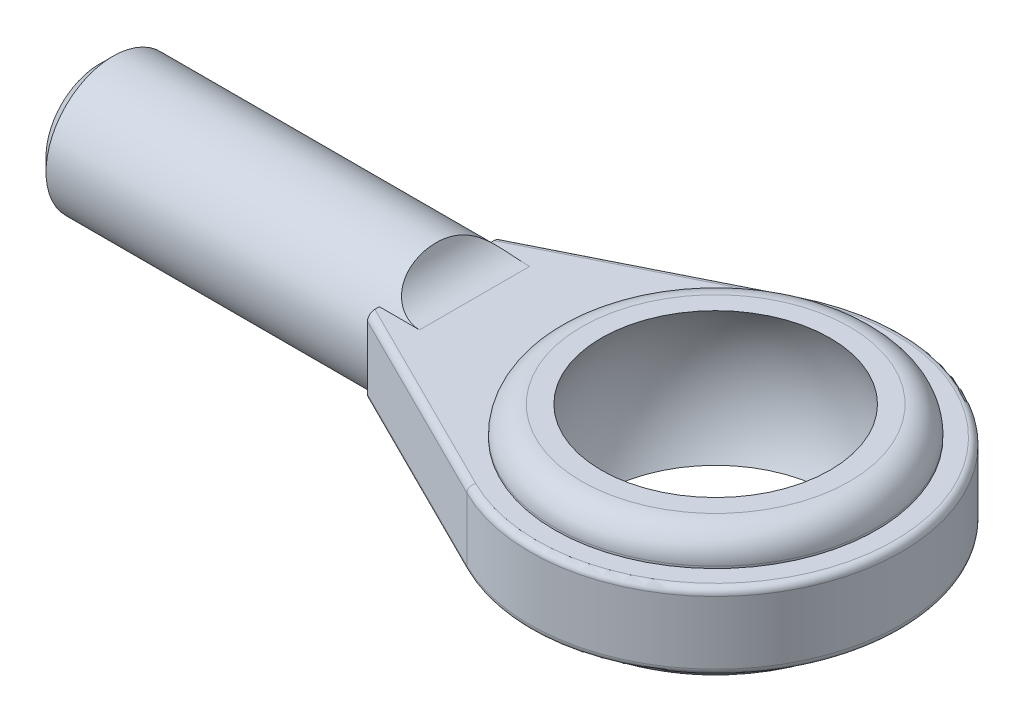
ISO-10303-21;
HEADER;
FILE_DESCRIPTION(('STEP AP214'),'2;1');
FILE_NAME('part.step','',(''),(''),'','','');
FILE_SCHEMA(('AUTOMOTIVE_DESIGN { 1 0 10303 214 1 1 1 1 }'));
ENDSEC;
DATA;
#1=APPLICATION_CONTEXT('core data for automotive mechanical design processes');
#2=APPLICATION_PROTOCOL_DEFINITION('international standard','automotive_design',2000,#1);
#3=PRODUCT_CONTEXT('',#1,'mechanical');
#4=PRODUCT('Part','Part','',(#3));
#5=PRODUCT_RELATED_PRODUCT_CATEGORY('part','',(#4));
#6=PRODUCT_DEFINITION_FORMATION('','',#4);
#7=PRODUCT_DEFINITION_CONTEXT('part definition',#1,'design');
#8=PRODUCT_DEFINITION('design','',#6,#7);
#9=PRODUCT_DEFINITION_SHAPE('','',#8);
#10=(LENGTH_UNIT() NAMED_UNIT(*) SI_UNIT(.MILLI.,.METRE.));
#11=(NAMED_UNIT(*) PLANE_ANGLE_UNIT() SI_UNIT($,.RADIAN.));
#12=(NAMED_UNIT(*) SI_UNIT($,.STERADIAN.) SOLID_ANGLE_UNIT());
#13=UNCERTAINTY_MEASURE_WITH_UNIT(LENGTH_MEASURE(1.E-05),#10,'distance_accuracy_value','');
#14=(GEOMETRIC_REPRESENTATION_CONTEXT(3) GLOBAL_UNCERTAINTY_ASSIGNED_CONTEXT((#13)) GLOBAL_UNIT_ASSIGNED_CONTEXT((#10,
#11,#12)) REPRESENTATION_CONTEXT('',''));
#15=CARTESIAN_POINT('',(0.,0.,0.));
#16=DIRECTION('',(0.,0.,1.));
#17=DIRECTION('',(1.,0.,0.));
#18=AXIS2_PLACEMENT_3D('',#15,#16,#17);
#19=CARTESIAN_POINT('',(46.,-5.,0.));
#20=DIRECTION('',(0.,1.,0.));
#21=DIRECTION('',(0.,0.,1.));
#22=AXIS2_PLACEMENT_3D('',#19,#20,#21);
#23=PLANE('',#22);
#24=CARTESIAN_POINT('',(46.,-5.,0.));
#25=DIRECTION('',(0.,1.,0.));
#26=DIRECTION('',(0.,0.,1.));
#27=AXIS2_PLACEMENT_3D('',#24,#25,#26);
#28=CIRCLE('',#27,10.);
#29=CARTESIAN_POINT('',(46.,-5.,10.));
#30=VERTEX_POINT('',#29);
#31=EDGE_CURVE('E494',#30,#30,#28,.F.);
#32=ORIENTED_EDGE('',*,*,#31,.T.);
#33=EDGE_LOOP('',(#32));
#34=FACE_BOUND('',#33,.T.);
#35=CARTESIAN_POINT('',(46.,-5.,0.));
#36=DIRECTION('',(0.,1.,0.));
#37=DIRECTION('',(0.,0.,1.));
#38=AXIS2_PLACEMENT_3D('',#35,#36,#37);
#39=CIRCLE('',#38,8.54458893101359);
#40=CARTESIAN_POINT('',(46.,-5.,8.54458893101359));
#41=VERTEX_POINT('',#40);
#42=EDGE_CURVE('E482',#41,#41,#39,.F.);
#43=ORIENTED_EDGE('',*,*,#42,.F.);
#44=EDGE_LOOP('',(#43));
#45=FACE_BOUND('',#44,.T.);
#46=ADVANCED_FACE('F36',(#34,#45),#23,.F.);
#47=CARTESIAN_POINT('',(46.,5.,0.));
#48=DIRECTION('',(0.,1.,0.));
#49=DIRECTION('',(0.,0.,1.));
#50=AXIS2_PLACEMENT_3D('',#47,#48,#49);
#51=PLANE('',#50);
#52=CARTESIAN_POINT('',(46.,5.,0.));
#53=DIRECTION('',(0.,1.,0.));
#54=DIRECTION('',(0.,0.,1.));
#55=AXIS2_PLACEMENT_3D('',#52,#53,#54);
#56=CIRCLE('',#55,10.);
#57=CARTESIAN_POINT('',(46.,5.,10.));
#58=VERTEX_POINT('',#57);
#59=EDGE_CURVE('E46',#58,#58,#56,.T.);
#60=ORIENTED_EDGE('',*,*,#59,.T.);
#61=EDGE_LOOP('',(#60));
#62=FACE_BOUND('',#61,.T.);
#63=CARTESIAN_POINT('',(46.,5.,0.));
#64=DIRECTION('',(0.,1.,0.));
#65=DIRECTION('',(0.,0.,1.));
#66=AXIS2_PLACEMENT_3D('',#63,#64,#65);
#67=CIRCLE('',#66,8.54458893101359);
#68=CARTESIAN_POINT('',(46.,5.,8.54458893101359));
#69=VERTEX_POINT('',#68);
#70=EDGE_CURVE('E40',#69,#69,#67,.F.);
#71=ORIENTED_EDGE('',*,*,#70,.T.);
#72=EDGE_LOOP('',(#71));
#73=FACE_BOUND('',#72,.T.);
#74=ADVANCED_FACE('F152',(#62,#73),#51,.T.);
#75=CARTESIAN_POINT('',(0.,2.85,0.));
#76=DIRECTION('',(0.,1.,0.));
#77=DIRECTION('',(0.,0.,1.));
#78=AXIS2_PLACEMENT_3D('',#75,#76,#77);
#79=PLANE('',#78);
#80=DIRECTION('',(0.,0.,1.));
#81=VECTOR('',#80,1.);
#82=CARTESIAN_POINT('',(28.,2.85,4.10822346032929));
#83=LINE('',#82,#81);
#84=CARTESIAN_POINT('',(28.,2.85,-4.10822346032929));
#85=VERTEX_POINT('',#84);
#86=CARTESIAN_POINT('',(28.,2.85,4.10822346032929));
#87=VERTEX_POINT('',#86);
#88=EDGE_CURVE('E90',#85,#87,#83,.T.);
#89=ORIENTED_EDGE('',*,*,#88,.T.);
#90=DIRECTION('',(-1.,0.,0.));
#91=VECTOR('',#90,1.);
#92=CARTESIAN_POINT('',(28.,2.85,4.10822346032929));
#93=LINE('',#92,#91);
#94=CARTESIAN_POINT('',(25.,2.85,4.10822346032929));
#95=VERTEX_POINT('',#94);
#96=EDGE_CURVE('E95',#87,#95,#93,.T.);
#97=ORIENTED_EDGE('',*,*,#96,.T.);
#98=DIRECTION('',(0.,0.,1.));
#99=VECTOR('',#98,1.);
#100=CARTESIAN_POINT('',(25.,2.85,0.));
#101=LINE('',#100,#99);
#102=CARTESIAN_POINT('',(25.,2.85,4.4412127348407));
#103=VERTEX_POINT('',#102);
#104=EDGE_CURVE('E292',#95,#103,#101,.T.);
#105=ORIENTED_EDGE('',*,*,#104,.T.);
#106=DIRECTION('',(0.894794908859371,0.,0.446477402652531));
#107=VECTOR('',#106,1.);
#108=CARTESIAN_POINT('',(40.0395266745887,2.85,11.9455120332726));
#109=LINE('',#108,#107);
#110=CARTESIAN_POINT('',(40.0395266745887,2.85,11.9455120332726));
#111=VERTEX_POINT('',#110);
#112=EDGE_CURVE('E231',#103,#111,#109,.T.);
#113=ORIENTED_EDGE('',*,*,#112,.T.);
#114=CARTESIAN_POINT('',(46.,2.85,0.));
#115=DIRECTION('',(0.,1.,0.));
#116=DIRECTION('',(0.,0.,1.));
#117=AXIS2_PLACEMENT_3D('',#114,#115,#116);
#118=CIRCLE('',#117,13.35);
#119=CARTESIAN_POINT('',(40.0395266745887,2.85,-11.9455120332726));
#120=VERTEX_POINT('',#119);
#121=EDGE_CURVE('E234',#111,#120,#118,.T.);
#122=ORIENTED_EDGE('',*,*,#121,.T.);
#123=DIRECTION('',(-0.894794908859371,0.,0.446477402652531));
#124=VECTOR('',#123,1.);
#125=CARTESIAN_POINT('',(25.2232387013263,2.85,-4.55260254557032));
#126=LINE('',#125,#124);
#127=CARTESIAN_POINT('',(25.,2.85,-4.44121273484069));
#128=VERTEX_POINT('',#127);
#129=EDGE_CURVE('E237',#120,#128,#126,.T.);
#130=ORIENTED_EDGE('',*,*,#129,.T.);
#131=CARTESIAN_POINT('',(25.,2.85,-4.10822346032929));
#132=VERTEX_POINT('',#131);
#133=EDGE_CURVE('E294',#128,#132,#101,.T.);
#134=ORIENTED_EDGE('',*,*,#133,.T.);
#135=DIRECTION('',(-1.,0.,0.));
#136=VECTOR('',#135,1.);
#137=CARTESIAN_POINT('',(25.,2.85,-4.10822346032929));
#138=LINE('',#137,#136);
#139=EDGE_CURVE('E54',#132,#85,#138,.F.);
#140=ORIENTED_EDGE('',*,*,#139,.T.);
#141=EDGE_LOOP('',(#89,#97,#105,#113,#122,#130,#134,#140));
#142=FACE_BOUND('',#141,.T.);
#143=CARTESIAN_POINT('',(46.,2.85,0.));
#144=DIRECTION('',(0.,1.,0.));
#145=DIRECTION('',(0.,0.,1.));
#146=AXIS2_PLACEMENT_3D('',#143,#144,#145);
#147=CIRCLE('',#146,12.);
#148=CARTESIAN_POINT('',(46.,2.85,12.));
#149=VERTEX_POINT('',#148);
#150=EDGE_CURVE('E264',#149,#149,#147,.F.);
#151=ORIENTED_EDGE('',*,*,#150,.T.);
#152=EDGE_LOOP('',(#151));
#153=FACE_BOUND('',#152,.T.);
#154=ADVANCED_FACE('F105',(#142,#153),#79,.T.);
#155=CARTESIAN_POINT('',(0.,-2.85,0.));
#156=DIRECTION('',(0.,1.,0.));
#157=DIRECTION('',(0.,0.,1.));
#158=AXIS2_PLACEMENT_3D('',#155,#156,#157);
#159=PLANE('',#158);
#160=DIRECTION('',(0.,0.,1.));
#161=VECTOR('',#160,1.);
#162=CARTESIAN_POINT('',(25.,-2.85,0.));
#163=LINE('',#162,#161);
#164=CARTESIAN_POINT('',(25.,-2.85,4.10822346032929));
#165=VERTEX_POINT('',#164);
#166=CARTESIAN_POINT('',(25.,-2.85,4.44121273484069));
#167=VERTEX_POINT('',#166);
#168=EDGE_CURVE('E260',#165,#167,#163,.T.);
#169=ORIENTED_EDGE('',*,*,#168,.F.);
#170=DIRECTION('',(-1.,0.,0.));
#171=VECTOR('',#170,1.);
#172=CARTESIAN_POINT('',(25.,-2.85,4.10822346032929));
#173=LINE('',#172,#171);
#174=CARTESIAN_POINT('',(28.,-2.85,4.10822346032929));
#175=VERTEX_POINT('',#174);
#176=EDGE_CURVE('E108',#165,#175,#173,.F.);
#177=ORIENTED_EDGE('',*,*,#176,.T.);
#178=DIRECTION('',(0.,0.,1.));
#179=VECTOR('',#178,1.);
#180=CARTESIAN_POINT('',(28.,-2.85,0.));
#181=LINE('',#180,#179);
#182=CARTESIAN_POINT('',(28.,-2.85,-4.10822346032929));
#183=VERTEX_POINT('',#182);
#184=EDGE_CURVE('E269',#175,#183,#181,.F.);
#185=ORIENTED_EDGE('',*,*,#184,.T.);
#186=DIRECTION('',(-1.,0.,0.));
#187=VECTOR('',#186,1.);
#188=CARTESIAN_POINT('',(28.,-2.85,-4.10822346032929));
#189=LINE('',#188,#187);
#190=CARTESIAN_POINT('',(25.,-2.85,-4.10822346032929));
#191=VERTEX_POINT('',#190);
#192=EDGE_CURVE('E252',#183,#191,#189,.T.);
#193=ORIENTED_EDGE('',*,*,#192,.T.);
#194=CARTESIAN_POINT('',(25.,-2.85,-4.44121273484069));
#195=VERTEX_POINT('',#194);
#196=EDGE_CURVE('E285',#195,#191,#163,.T.);
#197=ORIENTED_EDGE('',*,*,#196,.F.);
#198=DIRECTION('',(-0.894794908859371,0.,0.446477402652531));
#199=VECTOR('',#198,1.);
#200=CARTESIAN_POINT('',(3.20926194423882,-2.85,6.43175048018243));
#201=LINE('',#200,#199);
#202=CARTESIAN_POINT('',(40.0395266745887,-2.85,-11.9455120332726));
#203=VERTEX_POINT('',#202);
#204=EDGE_CURVE('E213',#195,#203,#201,.F.);
#205=ORIENTED_EDGE('',*,*,#204,.T.);
#206=CARTESIAN_POINT('',(46.,-2.85,0.));
#207=DIRECTION('',(0.,1.,0.));
#208=DIRECTION('',(0.,0.,1.));
#209=AXIS2_PLACEMENT_3D('',#206,#207,#208);
#210=CIRCLE('',#209,13.35);
#211=CARTESIAN_POINT('',(40.0395266745887,-2.85,11.9455120332726));
#212=VERTEX_POINT('',#211);
#213=EDGE_CURVE('E216',#203,#212,#210,.F.);
#214=ORIENTED_EDGE('',*,*,#213,.T.);
#215=DIRECTION('',(0.894794908859371,0.,0.446477402652531));
#216=VECTOR('',#215,1.);
#217=CARTESIAN_POINT('',(3.20926194423882,-2.85,-6.43175048018243));
#218=LINE('',#217,#216);
#219=EDGE_CURVE('E219',#212,#167,#218,.F.);
#220=ORIENTED_EDGE('',*,*,#219,.T.);
#221=EDGE_LOOP('',(#169,#177,#185,#193,#197,#205,#214,#220));
#222=FACE_BOUND('',#221,.T.);
#223=CARTESIAN_POINT('',(46.,-2.85,0.));
#224=DIRECTION('',(0.,1.,0.));
#225=DIRECTION('',(0.,0.,1.));
#226=AXIS2_PLACEMENT_3D('',#223,#224,#225);
#227=CIRCLE('',#226,12.);
#228=CARTESIAN_POINT('',(46.,-2.85,12.));
#229=VERTEX_POINT('',#228);
#230=EDGE_CURVE('E91',#229,#229,#227,.F.);
#231=ORIENTED_EDGE('',*,*,#230,.F.);
#232=EDGE_LOOP('',(#231));
#233=FACE_BOUND('',#232,.T.);
#234=ADVANCED_FACE('F166',(#222,#233),#159,.F.);
#235=CARTESIAN_POINT('',(25.,0.,0.));
#236=DIRECTION('',(-1.,0.,0.));
#237=DIRECTION('',(0.,0.,1.));
#238=AXIS2_PLACEMENT_3D('',#235,#236,#237);
#239=CYLINDRICAL_SURFACE('',#238,5.);
#240=CARTESIAN_POINT('',(0.999999999999994,0.,0.));
#241=DIRECTION('',(1.,0.,0.));
#242=DIRECTION('',(0.,0.,-1.));
#243=AXIS2_PLACEMENT_3D('',#240,#241,#242);
#244=CIRCLE('',#243,5.);
#245=CARTESIAN_POINT('',(0.999999999999994,0.,-5.));
#246=VERTEX_POINT('',#245);
#247=EDGE_CURVE('E201',#246,#246,#244,.T.);
#248=ORIENTED_EDGE('',*,*,#247,.T.);
#249=EDGE_LOOP('',(#248));
#250=FACE_BOUND('',#249,.T.);
#251=CARTESIAN_POINT('',(25.,0.,0.));
#252=DIRECTION('',(1.,0.,0.));
#253=DIRECTION('',(0.,0.,-1.));
#254=AXIS2_PLACEMENT_3D('',#251,#252,#253);
#255=CIRCLE('',#254,5.);
#256=CARTESIAN_POINT('',(25.,0.,-5.));
#257=VERTEX_POINT('',#256);
#258=EDGE_CURVE('E207',#257,#132,#255,.T.);
#259=ORIENTED_EDGE('',*,*,#258,.F.);
#260=EDGE_CURVE('E281',#191,#257,#255,.T.);
#261=ORIENTED_EDGE('',*,*,#260,.F.);
#262=ORIENTED_EDGE('',*,*,#192,.F.);
#263=CARTESIAN_POINT('',(28.,-2.85,-4.10822346032929));
#264=CARTESIAN_POINT('',(27.9303186688484,-2.84998832247719,-4.10821820050659));
#265=CARTESIAN_POINT('',(27.8606402898119,-2.85242754556558,-4.10653904132021));
#266=CARTESIAN_POINT('',(27.7217870519596,-2.86212066891751,-4.09979623791976));
#267=CARTESIAN_POINT('',(27.6526121704488,-2.86937435079394,-4.0947327472212));
#268=CARTESIAN_POINT('',(27.5153444812102,-2.88859705028777,-4.08119321639225));
#269=CARTESIAN_POINT('',(27.4472504091321,-2.90056005890779,-4.07272152474992));
#270=CARTESIAN_POINT('',(27.3125646655309,-2.92901054021996,-4.05230811407998));
#271=CARTESIAN_POINT('',(27.2459729659732,-2.94549792841068,-4.0403664598603));
#272=CARTESIAN_POINT('',(27.049076056239,-3.00143940580205,-3.99919237297866));
#273=CARTESIAN_POINT('',(26.921617891859,-3.04737729302536,-3.96460786181355));
#274=CARTESIAN_POINT('',(26.6782342153292,-3.15359642341774,-3.88064070023662));
#275=CARTESIAN_POINT('',(26.5623040208376,-3.21387180906914,-3.83126409093543));
#276=CARTESIAN_POINT('',(26.3443836809313,-3.34497860422588,-3.71734380494492));
#277=CARTESIAN_POINT('',(26.2424220719609,-3.41583102259598,-3.6527697914657));
#278=CARTESIAN_POINT('',(26.0543198858799,-3.56337668279178,-3.50897998035171));
#279=CARTESIAN_POINT('',(25.968183880406,-3.64007160335317,-3.42975996505655));
#280=CARTESIAN_POINT('',(25.807255855965,-3.79927869136991,-3.25276298317516));
#281=CARTESIAN_POINT('',(25.7334536941143,-3.88186392796828,-3.15415815564555));
#282=CARTESIAN_POINT('',(25.6025282132696,-4.04362480894875,-2.94392582919759));
#283=CARTESIAN_POINT('',(25.5454164026809,-4.12279806877034,-2.83228941856293));
#284=CARTESIAN_POINT('',(25.4592489368039,-4.25346305387998,-2.63027889944279));
#285=CARTESIAN_POINT('',(25.4267878409945,-4.30662418855518,-2.54238694083889));
#286=CARTESIAN_POINT('',(25.3684964844295,-4.40825692737118,-2.36177936231872));
#287=CARTESIAN_POINT('',(25.3426687467899,-4.45672674272976,-2.26906192302381));
#288=CARTESIAN_POINT('',(25.2966417977775,-4.54827630510536,-2.07949187759872));
#289=CARTESIAN_POINT('',(25.2764512996815,-4.59134765190238,-1.98263313392876));
#290=CARTESIAN_POINT('',(25.2408270808472,-4.67148931632098,-1.78563587186882));
#291=CARTESIAN_POINT('',(25.2253929638033,-4.70856013378933,-1.68549762749908));
#292=CARTESIAN_POINT('',(25.1982135555671,-4.77697915423675,-1.48065912405262));
#293=CARTESIAN_POINT('',(25.1865436162853,-4.80820575782674,-1.3759083915642));
#294=CARTESIAN_POINT('',(25.1665829078419,-4.86378537938973,-1.16428597928896));
#295=CARTESIAN_POINT('',(25.1582922396844,-4.88813819190307,-1.05741423620666));
#296=CARTESIAN_POINT('',(25.1445371722631,-4.92977591978916,-0.842207436817576));
#297=CARTESIAN_POINT('',(25.1390707312865,-4.94706593915406,-0.733873495877078));
#298=CARTESIAN_POINT('',(25.130559374402,-4.97449067563795,-0.516212236972134));
#299=CARTESIAN_POINT('',(25.127514441644,-4.98462544254699,-0.406884925925445));
#300=CARTESIAN_POINT('',(25.1236153195624,-4.99767523058154,-0.18781943289105));
#301=CARTESIAN_POINT('',(25.1227599886208,-5.00059401396,-0.0780814948990185));
#302=CARTESIAN_POINT('',(25.1231701806434,-4.9992058851635,0.141342679568152));
#303=CARTESIAN_POINT('',(25.1244356678111,-4.99489909494563,0.251028916884665));
#304=CARTESIAN_POINT('',(25.1291880173162,-4.97907678914304,0.469946168769332));
#305=CARTESIAN_POINT('',(25.1326771373973,-4.96755394701781,0.579176606954942));
#306=CARTESIAN_POINT('',(25.1421431882871,-4.93736452364006,0.796537785527815));
#307=CARTESIAN_POINT('',(25.1481201674756,-4.91869780346591,0.904668504487686));
#308=CARTESIAN_POINT('',(25.1641920581718,-4.87074633425353,1.13667833061227));
#309=CARTESIAN_POINT('',(25.174797206284,-4.84023137193876,1.2602709700166));
#310=CARTESIAN_POINT('',(25.2008842542286,-4.77002200078848,1.50433209585922));
#311=CARTESIAN_POINT('',(25.2163671842234,-4.73032565336339,1.62479991652979));
#312=CARTESIAN_POINT('',(25.2534128504999,-4.64230090484644,1.86144038246558));
#313=CARTESIAN_POINT('',(25.2749689744178,-4.59398191276633,1.9776175445599));
#314=CARTESIAN_POINT('',(25.3256259788118,-4.48945065090949,2.20463697680034));
#315=CARTESIAN_POINT('',(25.3547232409578,-4.43324217251746,2.31548177532121));
#316=CARTESIAN_POINT('',(25.4118239756425,-4.33223716110919,2.49780823041855));
#317=CARTESIAN_POINT('',(25.4374637004573,-4.28917584696735,2.57100026574287));
#318=CARTESIAN_POINT('',(25.493734082226,-4.20033445781241,2.71371493832222));
#319=CARTESIAN_POINT('',(25.5243634414637,-4.15455509167914,2.78323852346884));
#320=CARTESIAN_POINT('',(25.5911105688942,-4.06099288971023,2.91805706483879));
#321=CARTESIAN_POINT('',(25.6272215897753,-4.01321256847526,2.98335708078897));
#322=CARTESIAN_POINT('',(25.7053919090472,-3.91644218876245,3.10930862706907));
#323=CARTESIAN_POINT('',(25.7474503975808,-3.86745229573852,3.16996078855908));
#324=CARTESIAN_POINT('',(25.8695121213876,-3.73484849433126,3.326791027619));
#325=CARTESIAN_POINT('',(25.9555030636483,-3.65094592472109,3.41820045801525));
#326=CARTESIAN_POINT('',(26.1462276080144,-3.48796908278923,3.5843628206952));
#327=CARTESIAN_POINT('',(26.250952301285,-3.4088925393196,3.65912363245738));
#328=CARTESIAN_POINT('',(26.421033392792,-3.2982354871994,3.75820835100824));
#329=CARTESIAN_POINT('',(26.4800501045519,-3.26260023623442,3.78911885582788));
#330=CARTESIAN_POINT('',(26.6020317016305,-3.19471405657716,3.84652729435049));
#331=CARTESIAN_POINT('',(26.6649949560769,-3.1624617444558,3.87302703442705));
#332=CARTESIAN_POINT('',(26.7944957131381,-3.10193227724424,3.92167421379003));
#333=CARTESIAN_POINT('',(26.861036616825,-3.07365900055875,3.94381741496589));
#334=CARTESIAN_POINT('',(26.9970907236996,-3.02166603004237,3.98379337095368));
#335=CARTESIAN_POINT('',(27.0666025941523,-2.99794432011933,4.00162803512018));
#336=CARTESIAN_POINT('',(27.2060707056782,-2.95607041026386,4.03265532191704));
#337=CARTESIAN_POINT('',(27.2759599605587,-2.93778081640282,4.0459639783944));
#338=CARTESIAN_POINT('',(27.417478434309,-2.90620545649625,4.06870326339941));
#339=CARTESIAN_POINT('',(27.4891076445596,-2.89291966566907,4.07813391113315));
#340=CARTESIAN_POINT('',(27.6336488851626,-2.87155644111875,4.09320718119619));
#341=CARTESIAN_POINT('',(27.706562770614,-2.86348730486153,4.09884376938306));
#342=CARTESIAN_POINT('',(27.8529839836139,-2.85270112202323,4.1063490913996));
#343=CARTESIAN_POINT('',(27.9264913607415,-2.84998452732649,4.10821750710442));
#344=CARTESIAN_POINT('',(28.,-2.85,4.10822346032931));
#345=B_SPLINE_CURVE_WITH_KNOTS('',3,(#263,#264,#265,#266,#267,#268,#269,#270,#271,#272,#273,
#274,#275,#276,#277,#278,#279,#280,#281,#282,#283,#284,#285,#286,#287,#288,#289,#290,#291,#292,
#293,#294,#295,#296,#297,#298,#299,#300,#301,#302,#303,#304,#305,#306,#307,#308,#309,#310,#311,
#312,#313,#314,#315,#316,#317,#318,#319,#320,#321,#322,#323,#324,#325,#326,#327,#328,#329,#330,
#331,#332,#333,#334,#335,#336,#337,#338,#339,#340,#341,#342,#343,#344),.UNSPECIFIED.,.F.,.F.,(4,
2,2,2,2,2,2,2,2,2,2,2,2,2,2,2,2,2,2,2,2,2,2,2,2,2,2,2,2,2,2,2,2,2,2,2,2,2,2,2,4),(0.,
0.208975752294004,0.417942025954421,0.626642523032518,0.835339122495654,1.2526387231238,
1.66976812989201,2.08773737325647,2.50582716870298,2.94898553917731,3.39244876108348,
3.71522049033353,4.03811481034387,4.36150548779123,4.68486921277202,5.01435358496723,
5.34384780450535,5.67310348897956,6.00235688229557,6.33143857399572,6.66051471133568,
6.98992550636779,7.31934270752896,7.70212419816384,8.0849865845149,8.46743371879285,
8.84969768891184,9.11558754502652,9.38140835794533,9.64690458927438,9.91236470314916,
10.3632010773517,10.8138236235366,11.0402239450061,11.2665313176929,11.4930577688936,
11.7194836486012,11.9395671759841,12.1596496133758,12.3800812520987,12.6005314998019),.UNSPECIFIED.);
#346=EDGE_CURVE('E66',#183,#175,#345,.T.);
#347=ORIENTED_EDGE('',*,*,#346,.T.);
#348=ORIENTED_EDGE('',*,*,#176,.F.);
#349=CARTESIAN_POINT('',(25.,0.,5.));
#350=VERTEX_POINT('',#349);
#351=EDGE_CURVE('E277',#350,#165,#255,.T.);
#352=ORIENTED_EDGE('',*,*,#351,.F.);
#353=EDGE_CURVE('E100',#95,#350,#255,.T.);
#354=ORIENTED_EDGE('',*,*,#353,.F.);
#355=ORIENTED_EDGE('',*,*,#96,.F.);
#356=CARTESIAN_POINT('',(28.,2.85,4.10822346032929));
#357=CARTESIAN_POINT('',(27.9303186688484,2.84998832247719,4.10821820050659));
#358=CARTESIAN_POINT('',(27.8606402898119,2.85242754556558,4.10653904132021));
#359=CARTESIAN_POINT('',(27.7217870519596,2.86212066891751,4.09979623791976));
#360=CARTESIAN_POINT('',(27.6526121704488,2.86937435079394,4.0947327472212));
#361=CARTESIAN_POINT('',(27.5153444812102,2.88859705028777,4.08119321639225));
#362=CARTESIAN_POINT('',(27.4472504091321,2.90056005890779,4.07272152474992));
#363=CARTESIAN_POINT('',(27.3125646655309,2.92901054021996,4.05230811407998));
#364=CARTESIAN_POINT('',(27.2459729659732,2.94549792841068,4.0403664598603));
#365=CARTESIAN_POINT('',(27.049076056239,3.00143940580205,3.99919237297866));
#366=CARTESIAN_POINT('',(26.921617891859,3.04737729302536,3.96460786181355));
#367=CARTESIAN_POINT('',(26.6782342153292,3.15359642341774,3.88064070023662));
#368=CARTESIAN_POINT('',(26.5623040208376,3.21387180906914,3.83126409093543));
#369=CARTESIAN_POINT('',(26.3443836809313,3.34497860422588,3.71734380494492));
#370=CARTESIAN_POINT('',(26.2424220719609,3.41583102259598,3.6527697914657));
#371=CARTESIAN_POINT('',(26.0543198858799,3.56337668279178,3.50897998035171));
#372=CARTESIAN_POINT('',(25.968183880406,3.64007160335317,3.42975996505655));
#373=CARTESIAN_POINT('',(25.807255855965,3.79927869136991,3.25276298317516));
#374=CARTESIAN_POINT('',(25.7334536941143,3.88186392796828,3.15415815564555));
#375=CARTESIAN_POINT('',(25.6025282132696,4.04362480894875,2.94392582919759));
#376=CARTESIAN_POINT('',(25.5454164026809,4.12279806877034,2.83228941856293));
#377=CARTESIAN_POINT('',(25.4592489368039,4.25346305387998,2.63027889944279));
#378=CARTESIAN_POINT('',(25.4267878409945,4.30662418855518,2.54238694083889));
#379=CARTESIAN_POINT('',(25.3684964844295,4.40825692737118,2.36177936231872));
#380=CARTESIAN_POINT('',(25.3426687467899,4.45672674272976,2.26906192302381));
#381=CARTESIAN_POINT('',(25.2966417977775,4.54827630510536,2.07949187759872));
#382=CARTESIAN_POINT('',(25.2764512996815,4.59134765190238,1.98263313392876));
#383=CARTESIAN_POINT('',(25.2408270808472,4.67148931632098,1.78563587186882));
#384=CARTESIAN_POINT('',(25.2253929638033,4.70856013378933,1.68549762749908));
#385=CARTESIAN_POINT('',(25.1982135555671,4.77697915423675,1.48065912405262));
#386=CARTESIAN_POINT('',(25.1865436162853,4.80820575782674,1.3759083915642));
#387=CARTESIAN_POINT('',(25.1665829078419,4.86378537938973,1.16428597928896));
#388=CARTESIAN_POINT('',(25.1582922396844,4.88813819190307,1.05741423620666));
#389=CARTESIAN_POINT('',(25.1445371722631,4.92977591978916,0.842207436817576));
#390=CARTESIAN_POINT('',(25.1390707312865,4.94706593915406,0.733873495877078));
#391=CARTESIAN_POINT('',(25.130559374402,4.97449067563795,0.516212236972134));
#392=CARTESIAN_POINT('',(25.127514441644,4.98462544254699,0.406884925925445));
#393=CARTESIAN_POINT('',(25.1236153195624,4.99767523058154,0.18781943289105));
#394=CARTESIAN_POINT('',(25.1227599886208,5.00059401396,0.0780814948990185));
#395=CARTESIAN_POINT('',(25.1231701806434,4.9992058851635,-0.141342679568152));
#396=CARTESIAN_POINT('',(25.1244356678111,4.99489909494563,-0.251028916884665));
#397=CARTESIAN_POINT('',(25.1291880173162,4.97907678914304,-0.469946168769332));
#398=CARTESIAN_POINT('',(25.1326771373973,4.96755394701781,-0.579176606954942));
#399=CARTESIAN_POINT('',(25.1421431882871,4.93736452364006,-0.796537785527815));
#400=CARTESIAN_POINT('',(25.1481201674756,4.91869780346591,-0.904668504487686));
#401=CARTESIAN_POINT('',(25.1641920581718,4.87074633425353,-1.13667833061227));
#402=CARTESIAN_POINT('',(25.174797206284,4.84023137193876,-1.2602709700166));
#403=CARTESIAN_POINT('',(25.2008842542286,4.77002200078848,-1.50433209585922));
#404=CARTESIAN_POINT('',(25.2163671842234,4.73032565336339,-1.62479991652979));
#405=CARTESIAN_POINT('',(25.2534128504999,4.64230090484644,-1.86144038246558));
#406=CARTESIAN_POINT('',(25.2749689744178,4.59398191276633,-1.9776175445599));
#407=CARTESIAN_POINT('',(25.3256259788118,4.48945065090949,-2.20463697680034));
#408=CARTESIAN_POINT('',(25.3547232409578,4.43324217251746,-2.31548177532121));
#409=CARTESIAN_POINT('',(25.4118239756425,4.33223716110919,-2.49780823041855));
#410=CARTESIAN_POINT('',(25.4374637004573,4.28917584696735,-2.57100026574287));
#411=CARTESIAN_POINT('',(25.493734082226,4.20033445781241,-2.71371493832222));
#412=CARTESIAN_POINT('',(25.5243634414637,4.15455509167914,-2.78323852346884));
#413=CARTESIAN_POINT('',(25.5911105688942,4.06099288971023,-2.91805706483879));
#414=CARTESIAN_POINT('',(25.6272215897753,4.01321256847526,-2.98335708078897));
#415=CARTESIAN_POINT('',(25.7053919090472,3.91644218876245,-3.10930862706907));
#416=CARTESIAN_POINT('',(25.7474503975808,3.86745229573852,-3.16996078855908));
#417=CARTESIAN_POINT('',(25.8695121213876,3.73484849433126,-3.326791027619));
#418=CARTESIAN_POINT('',(25.9555030636483,3.65094592472109,-3.41820045801525));
#419=CARTESIAN_POINT('',(26.1462276080144,3.48796908278923,-3.5843628206952));
#420=CARTESIAN_POINT('',(26.250952301285,3.4088925393196,-3.65912363245738));
#421=CARTESIAN_POINT('',(26.421033392792,3.2982354871994,-3.75820835100824));
#422=CARTESIAN_POINT('',(26.4800501045519,3.26260023623442,-3.78911885582788));
#423=CARTESIAN_POINT('',(26.6020317016305,3.19471405657716,-3.84652729435049));
#424=CARTESIAN_POINT('',(26.6649949560769,3.1624617444558,-3.87302703442705));
#425=CARTESIAN_POINT('',(26.7944957131381,3.10193227724424,-3.92167421379003));
#426=CARTESIAN_POINT('',(26.861036616825,3.07365900055875,-3.94381741496589));
#427=CARTESIAN_POINT('',(26.9970907236996,3.02166603004237,-3.98379337095368));
#428=CARTESIAN_POINT('',(27.0666025941523,2.99794432011933,-4.00162803512018));
#429=CARTESIAN_POINT('',(27.2060707056782,2.95607041026386,-4.03265532191704));
#430=CARTESIAN_POINT('',(27.2759599605587,2.93778081640282,-4.0459639783944));
#431=CARTESIAN_POINT('',(27.417478434309,2.90620545649625,-4.06870326339941));
#432=CARTESIAN_POINT('',(27.4891076445596,2.89291966566907,-4.07813391113315));
#433=CARTESIAN_POINT('',(27.6336488851626,2.87155644111875,-4.09320718119619));
#434=CARTESIAN_POINT('',(27.706562770614,2.86348730486153,-4.09884376938306));
#435=CARTESIAN_POINT('',(27.8529839836139,2.85270112202323,-4.1063490913996));
#436=CARTESIAN_POINT('',(27.9264913607415,2.84998452732649,-4.10821750710442));
#437=CARTESIAN_POINT('',(28.,2.85,-4.10822346032931));
#438=B_SPLINE_CURVE_WITH_KNOTS('',3,(#356,#357,#358,#359,#360,#361,#362,#363,#364,#365,#366,
#367,#368,#369,#370,#371,#372,#373,#374,#375,#376,#377,#378,#379,#380,#381,#382,#383,#384,#385,
#386,#387,#388,#389,#390,#391,#392,#393,#394,#395,#396,#397,#398,#399,#400,#401,#402,#403,#404,
#405,#406,#407,#408,#409,#410,#411,#412,#413,#414,#415,#416,#417,#418,#419,#420,#421,#422,#423,
#424,#425,#426,#427,#428,#429,#430,#431,#432,#433,#434,#435,#436,#437),.UNSPECIFIED.,.F.,.F.,(4,
2,2,2,2,2,2,2,2,2,2,2,2,2,2,2,2,2,2,2,2,2,2,2,2,2,2,2,2,2,2,2,2,2,2,2,2,2,2,2,4),(0.,
0.208975752294004,0.417942025954421,0.626642523032518,0.835339122495654,1.2526387231238,
1.66976812989201,2.08773737325647,2.50582716870298,2.94898553917731,3.39244876108348,
3.71522049033353,4.03811481034387,4.36150548779123,4.68486921277202,5.01435358496723,
5.34384780450535,5.67310348897956,6.00235688229557,6.33143857399572,6.66051471133568,
6.98992550636779,7.31934270752896,7.70212419816384,8.0849865845149,8.46743371879285,
8.84969768891184,9.11558754502652,9.38140835794533,9.64690458927438,9.91236470314916,
10.3632010773517,10.8138236235366,11.0402239450061,11.2665313176929,11.4930577688936,
11.7194836486012,11.9395671759841,12.1596496133758,12.3800812520987,12.6005314998019),.UNSPECIFIED.);
#439=EDGE_CURVE('E85',#87,#85,#438,.T.);
#440=ORIENTED_EDGE('',*,*,#439,.T.);
#441=ORIENTED_EDGE('',*,*,#139,.F.);
#442=EDGE_LOOP('',(#259,#261,#262,#347,#348,#352,#354,#355,#440,#441));
#443=FACE_BOUND('',#442,.T.);
#444=ADVANCED_FACE('F96',(#250,#443),#239,.T.);
#445=CARTESIAN_POINT('',(0.,0.,0.));
#446=DIRECTION('',(1.,0.,0.));
#447=DIRECTION('',(0.,0.,-1.));
#448=AXIS2_PLACEMENT_3D('',#445,#446,#447);
#449=PLANE('',#448);
#450=CARTESIAN_POINT('',(0.,0.,0.));
#451=DIRECTION('',(1.,0.,0.));
#452=DIRECTION('',(0.,0.,-1.));
#453=AXIS2_PLACEMENT_3D('',#450,#451,#452);
#454=CIRCLE('',#453,4.);
#455=CARTESIAN_POINT('',(0.,0.,-4.));
#456=VERTEX_POINT('',#455);
#457=EDGE_CURVE('E199',#456,#456,#454,.F.);
#458=ORIENTED_EDGE('',*,*,#457,.T.);
#459=EDGE_LOOP('',(#458));
#460=FACE_BOUND('',#459,.T.);
#461=ADVANCED_FACE('F188',(#460),#449,.F.);
#462=CARTESIAN_POINT('',(0.999999999999994,0.,0.));
#463=DIRECTION('',(1.,0.,0.));
#464=DIRECTION('',(0.,0.,-1.));
#465=AXIS2_PLACEMENT_3D('',#462,#463,#464);
#466=CONICAL_SURFACE('',#465,5.,0.785398163397453);
#467=ORIENTED_EDGE('',*,*,#457,.F.);
#468=EDGE_LOOP('',(#467));
#469=FACE_BOUND('',#468,.T.);
#470=ORIENTED_EDGE('',*,*,#247,.F.);
#471=EDGE_LOOP('',(#470));
#472=FACE_BOUND('',#471,.T.);
#473=ADVANCED_FACE('F174',(#469,#472),#466,.T.);
#474=CARTESIAN_POINT('',(25.,2.85,0.));
#475=DIRECTION('',(1.,0.,0.));
#476=DIRECTION('',(0.,0.,-1.));
#477=AXIS2_PLACEMENT_3D('',#474,#475,#476);
#478=PLANE('',#477);
#479=DIRECTION('',(0.,-1.,0.));
#480=VECTOR('',#479,1.);
#481=CARTESIAN_POINT('',(25.,2.85,5.));
#482=LINE('',#481,#480);
#483=CARTESIAN_POINT('',(25.,2.35,5.));
#484=VERTEX_POINT('',#483);
#485=EDGE_CURVE('E298',#484,#350,#482,.T.);
#486=ORIENTED_EDGE('',*,*,#485,.F.);
#487=CARTESIAN_POINT('',(25.,2.35,4.44121273484069));
#488=DIRECTION('',(1.,0.,0.));
#489=DIRECTION('',(0.,0.,-1.));
#490=AXIS2_PLACEMENT_3D('',#487,#488,#489);
#491=ELLIPSE('',#490,0.558787265159308,0.5);
#492=EDGE_CURVE('E249',#484,#103,#491,.F.);
#493=ORIENTED_EDGE('',*,*,#492,.T.);
#494=ORIENTED_EDGE('',*,*,#104,.F.);
#495=ORIENTED_EDGE('',*,*,#353,.T.);
#496=EDGE_LOOP('',(#486,#493,#494,#495));
#497=FACE_BOUND('',#496,.T.);
#498=ADVANCED_FACE('F170',(#497),#478,.F.);
#499=ORIENTED_EDGE('',*,*,#168,.T.);
#500=CARTESIAN_POINT('',(25.,-2.35,4.44121273484069));
#501=DIRECTION('',(1.,0.,0.));
#502=DIRECTION('',(0.,0.,1.));
#503=AXIS2_PLACEMENT_3D('',#500,#501,#502);
#504=ELLIPSE('',#503,0.558787265159308,0.5);
#505=CARTESIAN_POINT('',(25.,-2.35,5.));
#506=VERTEX_POINT('',#505);
#507=EDGE_CURVE('E222',#167,#506,#504,.F.);
#508=ORIENTED_EDGE('',*,*,#507,.T.);
#509=EDGE_CURVE('E302',#350,#506,#482,.T.);
#510=ORIENTED_EDGE('',*,*,#509,.F.);
#511=ORIENTED_EDGE('',*,*,#351,.T.);
#512=EDGE_LOOP('',(#499,#508,#510,#511));
#513=FACE_BOUND('',#512,.T.);
#514=ADVANCED_FACE('F173',(#513),#478,.F.);
#515=ORIENTED_EDGE('',*,*,#133,.F.);
#516=CARTESIAN_POINT('',(25.,2.35,-4.44121273484069));
#517=DIRECTION('',(1.,0.,0.));
#518=DIRECTION('',(0.,0.,-1.));
#519=AXIS2_PLACEMENT_3D('',#516,#517,#518);
#520=ELLIPSE('',#519,0.558787265159308,0.5);
#521=CARTESIAN_POINT('',(25.,2.35,-5.));
#522=VERTEX_POINT('',#521);
#523=EDGE_CURVE('E240',#128,#522,#520,.F.);
#524=ORIENTED_EDGE('',*,*,#523,.T.);
#525=DIRECTION('',(0.,-1.,0.));
#526=VECTOR('',#525,1.);
#527=CARTESIAN_POINT('',(25.,2.85,-5.));
#528=LINE('',#527,#526);
#529=EDGE_CURVE('E303',#522,#257,#528,.T.);
#530=ORIENTED_EDGE('',*,*,#529,.T.);
#531=ORIENTED_EDGE('',*,*,#258,.T.);
#532=EDGE_LOOP('',(#515,#524,#530,#531));
#533=FACE_BOUND('',#532,.T.);
#534=ADVANCED_FACE('F323',(#533),#478,.F.);
#535=CARTESIAN_POINT('',(25.,-2.35,-5.));
#536=VERTEX_POINT('',#535);
#537=EDGE_CURVE('E301',#257,#536,#528,.T.);
#538=ORIENTED_EDGE('',*,*,#537,.T.);
#539=CARTESIAN_POINT('',(25.,-2.35,-4.44121273484069));
#540=DIRECTION('',(1.,0.,0.));
#541=DIRECTION('',(0.,0.,1.));
#542=AXIS2_PLACEMENT_3D('',#539,#540,#541);
#543=ELLIPSE('',#542,0.558787265159308,0.5);
#544=EDGE_CURVE('E246',#536,#195,#543,.F.);
#545=ORIENTED_EDGE('',*,*,#544,.T.);
#546=ORIENTED_EDGE('',*,*,#196,.T.);
#547=ORIENTED_EDGE('',*,*,#260,.T.);
#548=EDGE_LOOP('',(#538,#545,#546,#547));
#549=FACE_BOUND('',#548,.T.);
#550=ADVANCED_FACE('F176',(#549),#478,.F.);
#551=CARTESIAN_POINT('',(2.98602324291255,2.85,-5.98435302575275));
#552=DIRECTION('',(0.446477402652531,0.,-0.894794908859371));
#553=DIRECTION('',(-0.894794908859371,0.,-0.446477402652531));
#554=AXIS2_PLACEMENT_3D('',#551,#552,#553);
#555=PLANE('',#554);
#556=ORIENTED_EDGE('',*,*,#509,.T.);
#557=DIRECTION('',(0.894794908859371,0.,0.446477402652531));
#558=VECTOR('',#557,1.);
#559=CARTESIAN_POINT('',(2.98602324291255,-2.35,-5.98435302575275));
#560=LINE('',#559,#558);
#561=CARTESIAN_POINT('',(39.8162879732625,-2.35,12.3929094877023));
#562=VERTEX_POINT('',#561);
#563=EDGE_CURVE('E204',#506,#562,#560,.T.);
#564=ORIENTED_EDGE('',*,*,#563,.T.);
#565=DIRECTION('',(0.,-1.,0.));
#566=VECTOR('',#565,1.);
#567=CARTESIAN_POINT('',(39.8162879732625,2.85,12.3929094877023));
#568=LINE('',#567,#566);
#569=CARTESIAN_POINT('',(39.8162879732625,2.35,12.3929094877023));
#570=VERTEX_POINT('',#569);
#571=EDGE_CURVE('E308',#570,#562,#568,.T.);
#572=ORIENTED_EDGE('',*,*,#571,.F.);
#573=DIRECTION('',(0.894794908859371,0.,0.446477402652531));
#574=VECTOR('',#573,1.);
#575=CARTESIAN_POINT('',(25.,2.35,5.));
#576=LINE('',#575,#574);
#577=EDGE_CURVE('E200',#570,#484,#576,.F.);
#578=ORIENTED_EDGE('',*,*,#577,.T.);
#579=ORIENTED_EDGE('',*,*,#485,.T.);
#580=EDGE_LOOP('',(#556,#564,#572,#578,#579));
#581=FACE_BOUND('',#580,.T.);
#582=ADVANCED_FACE('F184',(#581),#555,.F.);
#583=CARTESIAN_POINT('',(46.,2.85,0.));
#584=DIRECTION('',(0.,-1.,0.));
#585=DIRECTION('',(0.,0.,-1.));
#586=AXIS2_PLACEMENT_3D('',#583,#584,#585);
#587=CYLINDRICAL_SURFACE('',#586,13.85);
#588=ORIENTED_EDGE('',*,*,#571,.T.);
#589=CARTESIAN_POINT('',(46.,-2.35,0.));
#590=DIRECTION('',(0.,1.,0.));
#591=DIRECTION('',(0.,0.,1.));
#592=AXIS2_PLACEMENT_3D('',#589,#590,#591);
#593=CIRCLE('',#592,13.85);
#594=CARTESIAN_POINT('',(39.8162879732625,-2.35,-12.3929094877023));
#595=VERTEX_POINT('',#594);
#596=EDGE_CURVE('E228',#562,#595,#593,.T.);
#597=ORIENTED_EDGE('',*,*,#596,.T.);
#598=DIRECTION('',(0.,-1.,0.));
#599=VECTOR('',#598,1.);
#600=CARTESIAN_POINT('',(39.8162879732625,2.85,-12.3929094877023));
#601=LINE('',#600,#599);
#602=CARTESIAN_POINT('',(39.8162879732625,2.35,-12.3929094877023));
#603=VERTEX_POINT('',#602);
#604=EDGE_CURVE('E306',#603,#595,#601,.T.);
#605=ORIENTED_EDGE('',*,*,#604,.F.);
#606=CARTESIAN_POINT('',(46.,2.35,0.));
#607=DIRECTION('',(0.,1.,0.));
#608=DIRECTION('',(0.,0.,1.));
#609=AXIS2_PLACEMENT_3D('',#606,#607,#608);
#610=CIRCLE('',#609,13.85);
#611=EDGE_CURVE('E225',#603,#570,#610,.F.);
#612=ORIENTED_EDGE('',*,*,#611,.T.);
#613=EDGE_LOOP('',(#588,#597,#605,#612));
#614=FACE_BOUND('',#613,.T.);
#615=ADVANCED_FACE('F181',(#614),#587,.T.);
#616=CARTESIAN_POINT('',(2.98602324291255,2.85,5.98435302575275));
#617=DIRECTION('',(0.446477402652531,0.,0.894794908859371));
#618=DIRECTION('',(0.894794908859371,0.,-0.446477402652531));
#619=AXIS2_PLACEMENT_3D('',#616,#617,#618);
#620=PLANE('',#619);
#621=ORIENTED_EDGE('',*,*,#529,.F.);
#622=DIRECTION('',(-0.894794908859371,0.,0.446477402652531));
#623=VECTOR('',#622,1.);
#624=CARTESIAN_POINT('',(39.8162879732625,2.35,-12.3929094877023));
#625=LINE('',#624,#623);
#626=EDGE_CURVE('E243',#522,#603,#625,.F.);
#627=ORIENTED_EDGE('',*,*,#626,.T.);
#628=ORIENTED_EDGE('',*,*,#604,.T.);
#629=DIRECTION('',(-0.894794908859371,0.,0.446477402652531));
#630=VECTOR('',#629,1.);
#631=CARTESIAN_POINT('',(2.98602324291255,-2.35,5.98435302575275));
#632=LINE('',#631,#630);
#633=EDGE_CURVE('E77',#595,#536,#632,.T.);
#634=ORIENTED_EDGE('',*,*,#633,.T.);
#635=ORIENTED_EDGE('',*,*,#537,.F.);
#636=EDGE_LOOP('',(#621,#627,#628,#634,#635));
#637=FACE_BOUND('',#636,.T.);
#638=ADVANCED_FACE('F177',(#637),#620,.F.);
#639=CARTESIAN_POINT('',(3.20926194423882,-2.35,6.43175048018243));
#640=DIRECTION('',(-0.894794908859371,0.,0.446477402652531));
#641=DIRECTION('',(0.446477402652531,0.,0.894794908859371));
#642=AXIS2_PLACEMENT_3D('',#639,#640,#641);
#643=CYLINDRICAL_SURFACE('',#642,0.5);
#644=ORIENTED_EDGE('',*,*,#544,.F.);
#645=ORIENTED_EDGE('',*,*,#633,.F.);
#646=CARTESIAN_POINT('',(40.0395266745887,-2.35,-11.9455120332726));
#647=DIRECTION('',(0.894794908859368,0.,-0.446477402652537));
#648=DIRECTION('',(-0.446477402652537,0.,-0.894794908859368));
#649=AXIS2_PLACEMENT_3D('',#646,#647,#648);
#650=CIRCLE('',#649,0.5);
#651=EDGE_CURVE('E256',#203,#595,#650,.T.);
#652=ORIENTED_EDGE('',*,*,#651,.F.);
#653=ORIENTED_EDGE('',*,*,#204,.F.);
#654=EDGE_LOOP('',(#644,#645,#652,#653));
#655=FACE_BOUND('',#654,.T.);
#656=ADVANCED_FACE('F180',(#655),#643,.T.);
#657=CARTESIAN_POINT('',(46.,-2.35,0.));
#658=DIRECTION('',(0.,1.,0.));
#659=DIRECTION('',(0.,0.,1.));
#660=AXIS2_PLACEMENT_3D('',#657,#658,#659);
#661=TOROIDAL_SURFACE('',#660,13.35,0.5);
#662=ORIENTED_EDGE('',*,*,#651,.T.);
#663=ORIENTED_EDGE('',*,*,#596,.F.);
#664=CARTESIAN_POINT('',(40.0395266745887,-2.35,11.9455120332726));
#665=DIRECTION('',(-0.894794908859368,0.,-0.446477402652537));
#666=DIRECTION('',(-0.446477402652537,0.,0.894794908859368));
#667=AXIS2_PLACEMENT_3D('',#664,#665,#666);
#668=CIRCLE('',#667,0.5);
#669=EDGE_CURVE('E253',#212,#562,#668,.T.);
#670=ORIENTED_EDGE('',*,*,#669,.F.);
#671=ORIENTED_EDGE('',*,*,#213,.F.);
#672=EDGE_LOOP('',(#662,#663,#670,#671));
#673=FACE_BOUND('',#672,.T.);
#674=ADVANCED_FACE('F352',(#673),#661,.T.);
#675=CARTESIAN_POINT('',(3.20926194423882,-2.35,-6.43175048018243));
#676=DIRECTION('',(0.894794908859371,0.,0.446477402652531));
#677=DIRECTION('',(0.446477402652531,0.,-0.894794908859371));
#678=AXIS2_PLACEMENT_3D('',#675,#676,#677);
#679=CYLINDRICAL_SURFACE('',#678,0.5);
#680=ORIENTED_EDGE('',*,*,#507,.F.);
#681=ORIENTED_EDGE('',*,*,#219,.F.);
#682=ORIENTED_EDGE('',*,*,#669,.T.);
#683=ORIENTED_EDGE('',*,*,#563,.F.);
#684=EDGE_LOOP('',(#680,#681,#682,#683));
#685=FACE_BOUND('',#684,.T.);
#686=ADVANCED_FACE('F356',(#685),#679,.T.);
#687=CARTESIAN_POINT('',(3.20926194423882,2.35,-6.43175048018243));
#688=DIRECTION('',(-0.894794908859371,0.,-0.446477402652531));
#689=DIRECTION('',(-0.446477402652531,0.,0.894794908859371));
#690=AXIS2_PLACEMENT_3D('',#687,#688,#689);
#691=CYLINDRICAL_SURFACE('',#690,0.5);
#692=ORIENTED_EDGE('',*,*,#492,.F.);
#693=ORIENTED_EDGE('',*,*,#577,.F.);
#694=CARTESIAN_POINT('',(40.0395266745887,2.35,11.9455120332726));
#695=DIRECTION('',(0.894794908859368,0.,0.446477402652537));
#696=DIRECTION('',(0.446477402652537,0.,-0.894794908859368));
#697=AXIS2_PLACEMENT_3D('',#694,#695,#696);
#698=CIRCLE('',#697,0.5);
#699=EDGE_CURVE('E257',#111,#570,#698,.T.);
#700=ORIENTED_EDGE('',*,*,#699,.F.);
#701=ORIENTED_EDGE('',*,*,#112,.F.);
#702=EDGE_LOOP('',(#692,#693,#700,#701));
#703=FACE_BOUND('',#702,.T.);
#704=ADVANCED_FACE('F132',(#703),#691,.T.);
#705=CARTESIAN_POINT('',(46.,2.35,0.));
#706=DIRECTION('',(0.,1.,0.));
#707=DIRECTION('',(0.,0.,1.));
#708=AXIS2_PLACEMENT_3D('',#705,#706,#707);
#709=TOROIDAL_SURFACE('',#708,13.35,0.5);
#710=ORIENTED_EDGE('',*,*,#699,.T.);
#711=ORIENTED_EDGE('',*,*,#611,.F.);
#712=CARTESIAN_POINT('',(40.0395266745887,2.35,-11.9455120332726));
#713=DIRECTION('',(-0.894794908859368,0.,0.446477402652536));
#714=DIRECTION('',(0.446477402652536,0.,0.894794908859368));
#715=AXIS2_PLACEMENT_3D('',#712,#713,#714);
#716=CIRCLE('',#715,0.5);
#717=EDGE_CURVE('E261',#120,#603,#716,.T.);
#718=ORIENTED_EDGE('',*,*,#717,.F.);
#719=ORIENTED_EDGE('',*,*,#121,.F.);
#720=EDGE_LOOP('',(#710,#711,#718,#719));
#721=FACE_BOUND('',#720,.T.);
#722=ADVANCED_FACE('F343',(#721),#709,.T.);
#723=CARTESIAN_POINT('',(3.20926194423882,2.35,6.43175048018243));
#724=DIRECTION('',(0.894794908859371,0.,-0.446477402652531));
#725=DIRECTION('',(-0.446477402652531,0.,-0.894794908859371));
#726=AXIS2_PLACEMENT_3D('',#723,#724,#725);
#727=CYLINDRICAL_SURFACE('',#726,0.5);
#728=ORIENTED_EDGE('',*,*,#717,.T.);
#729=ORIENTED_EDGE('',*,*,#626,.F.);
#730=ORIENTED_EDGE('',*,*,#523,.F.);
#731=ORIENTED_EDGE('',*,*,#129,.F.);
#732=EDGE_LOOP('',(#728,#729,#730,#731));
#733=FACE_BOUND('',#732,.T.);
#734=ADVANCED_FACE('F131',(#733),#727,.T.);
#735=CARTESIAN_POINT('',(28.,-5.85,0.));
#736=DIRECTION('',(0.,0.,1.));
#737=DIRECTION('',(1.,0.,0.));
#738=AXIS2_PLACEMENT_3D('',#735,#736,#737);
#739=CYLINDRICAL_SURFACE('',#738,3.);
#740=ORIENTED_EDGE('',*,*,#346,.F.);
#741=ORIENTED_EDGE('',*,*,#184,.F.);
#742=EDGE_LOOP('',(#740,#741));
#743=FACE_BOUND('',#742,.T.);
#744=ADVANCED_FACE('F127',(#743),#739,.F.);
#745=CARTESIAN_POINT('',(28.,5.85,0.));
#746=DIRECTION('',(0.,0.,-1.));
#747=DIRECTION('',(-1.,0.,0.));
#748=AXIS2_PLACEMENT_3D('',#745,#746,#747);
#749=CYLINDRICAL_SURFACE('',#748,3.);
#750=ORIENTED_EDGE('',*,*,#88,.F.);
#751=ORIENTED_EDGE('',*,*,#439,.F.);
#752=EDGE_LOOP('',(#750,#751));
#753=FACE_BOUND('',#752,.T.);
#754=ADVANCED_FACE('F88',(#753),#749,.F.);
#755=CARTESIAN_POINT('',(46.,5.,0.));
#756=DIRECTION('',(0.,-1.,0.));
#757=DIRECTION('',(0.,0.,-1.));
#758=AXIS2_PLACEMENT_3D('',#755,#756,#757);
#759=CYLINDRICAL_SURFACE('',#758,12.);
#760=CARTESIAN_POINT('',(46.,-3.,0.));
#761=DIRECTION('',(0.,1.,0.));
#762=DIRECTION('',(0.,0.,1.));
#763=AXIS2_PLACEMENT_3D('',#760,#761,#762);
#764=CIRCLE('',#763,12.);
#765=CARTESIAN_POINT('',(46.,-3.,12.));
#766=VERTEX_POINT('',#765);
#767=EDGE_CURVE('E491',#766,#766,#764,.T.);
#768=ORIENTED_EDGE('',*,*,#767,.T.);
#769=EDGE_LOOP('',(#768));
#770=FACE_BOUND('',#769,.T.);
#771=ORIENTED_EDGE('',*,*,#230,.T.);
#772=EDGE_LOOP('',(#771));
#773=FACE_BOUND('',#772,.T.);
#774=ADVANCED_FACE('F136',(#770,#773),#759,.T.);
#775=CARTESIAN_POINT('',(46.,3.,0.));
#776=DIRECTION('',(0.,1.,0.));
#777=DIRECTION('',(0.,0.,1.));
#778=AXIS2_PLACEMENT_3D('',#775,#776,#777);
#779=CIRCLE('',#778,12.);
#780=CARTESIAN_POINT('',(46.,3.,12.));
#781=VERTEX_POINT('',#780);
#782=EDGE_CURVE('E11',#781,#781,#779,.F.);
#783=ORIENTED_EDGE('',*,*,#782,.T.);
#784=EDGE_LOOP('',(#783));
#785=FACE_BOUND('',#784,.T.);
#786=ORIENTED_EDGE('',*,*,#150,.F.);
#787=EDGE_LOOP('',(#786));
#788=FACE_BOUND('',#787,.T.);
#789=ADVANCED_FACE('F139',(#785,#788),#759,.T.);
#790=CARTESIAN_POINT('',(46.,-3.,0.));
#791=DIRECTION('',(0.,1.,0.));
#792=DIRECTION('',(0.,0.,1.));
#793=AXIS2_PLACEMENT_3D('',#790,#791,#792);
#794=TOROIDAL_SURFACE('',#793,10.,2.);
#795=ORIENTED_EDGE('',*,*,#31,.F.);
#796=EDGE_LOOP('',(#795));
#797=FACE_BOUND('',#796,.T.);
#798=ORIENTED_EDGE('',*,*,#767,.F.);
#799=EDGE_LOOP('',(#798));
#800=FACE_BOUND('',#799,.T.);
#801=ADVANCED_FACE('F137',(#797,#800),#794,.T.);
#802=CARTESIAN_POINT('',(46.,3.,0.));
#803=DIRECTION('',(0.,1.,0.));
#804=DIRECTION('',(0.,0.,1.));
#805=AXIS2_PLACEMENT_3D('',#802,#803,#804);
#806=TOROIDAL_SURFACE('',#805,10.,2.);
#807=ORIENTED_EDGE('',*,*,#782,.F.);
#808=EDGE_LOOP('',(#807));
#809=FACE_BOUND('',#808,.T.);
#810=ORIENTED_EDGE('',*,*,#59,.F.);
#811=EDGE_LOOP('',(#810));
#812=FACE_BOUND('',#811,.T.);
#813=ADVANCED_FACE('F38',(#809,#812),#806,.T.);
#814=CARTESIAN_POINT('',(46.,0.,0.));
#815=DIRECTION('',(0.,0.,-1.));
#816=DIRECTION('',(1.,0.,0.));
#817=AXIS2_PLACEMENT_3D('',#814,#815,#816);
#818=SPHERICAL_SURFACE('',#817,9.9);
#819=CARTESIAN_POINT('',(46.,0.,0.));
#820=DIRECTION('',(0.,1.,0.));
#821=DIRECTION('',(0.,0.,1.));
#822=AXIS2_PLACEMENT_3D('',#819,#820,#821);
#823=SPHERICAL_SURFACE('',#822,9.9);
#824=ORIENTED_EDGE('',*,*,#70,.F.);
#825=EDGE_LOOP('',(#824));
#826=FACE_BOUND('',#825,.T.);
#827=ORIENTED_EDGE('',*,*,#42,.T.);
#828=EDGE_LOOP('',(#827));
#829=FACE_BOUND('',#828,.T.);
#830=ADVANCED_FACE('F145',(#826,#829),#823,.F.);
#831=CLOSED_SHELL('',(#46,#74,#154,#234,#444,#461,#473,#498,#514,#534,#550,#582,#615,#638,#656,
#674,#686,#704,#722,#734,#744,#754,#774,#789,#801,#813,#830));
#832=MANIFOLD_SOLID_BREP('B2',#831);
#833=ADVANCED_BREP_SHAPE_REPRESENTATION('',(#18,#832),#14);
#834=SHAPE_DEFINITION_REPRESENTATION(#9,#833);
ENDSEC;
END-ISO-10303-21;
